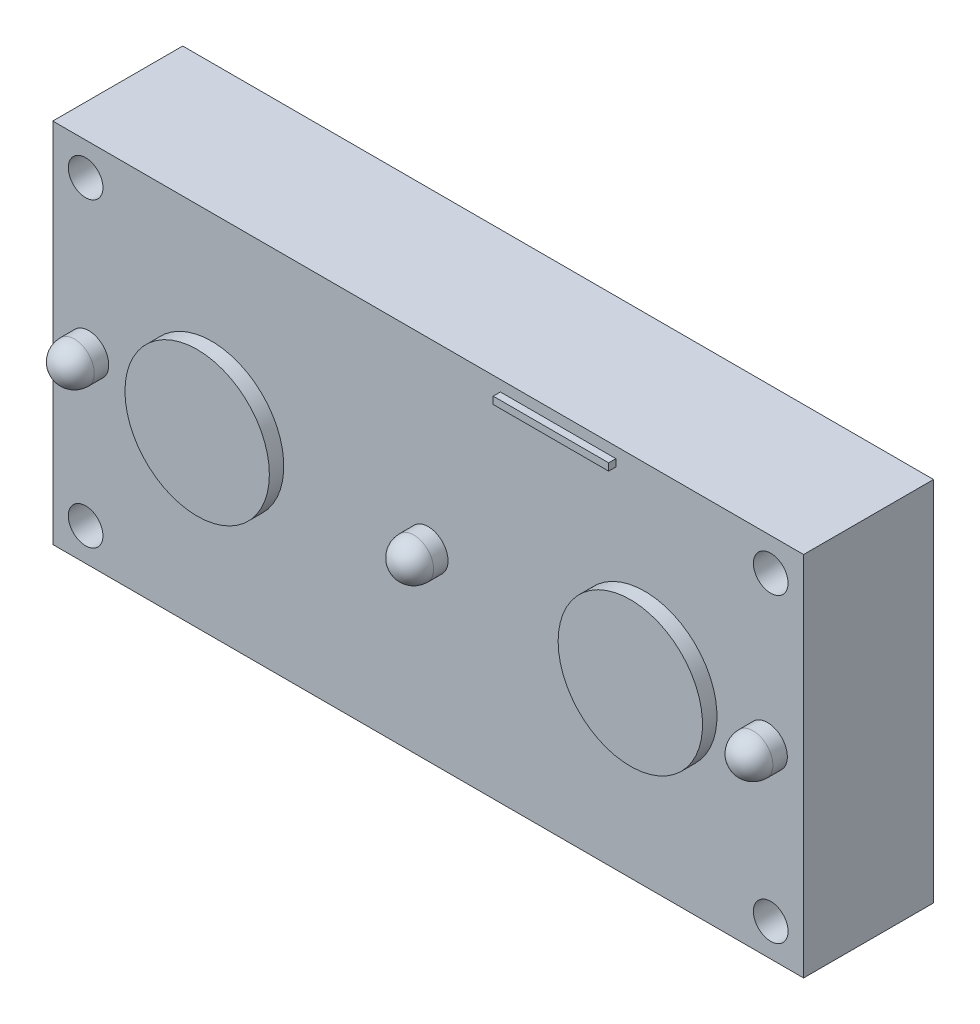
ISO-10303-21;
HEADER;
FILE_DESCRIPTION(('STEP AP214'),'2;1');
FILE_NAME('part.step','',(''),(''),'','','');
FILE_SCHEMA(('AUTOMOTIVE_DESIGN { 1 0 10303 214 1 1 1 1 }'));
ENDSEC;
DATA;
#1=APPLICATION_CONTEXT('core data for automotive mechanical design processes');
#2=APPLICATION_PROTOCOL_DEFINITION('international standard','automotive_design',2000,#1);
#3=PRODUCT_CONTEXT('',#1,'mechanical');
#4=PRODUCT('Part','Part','',(#3));
#5=PRODUCT_RELATED_PRODUCT_CATEGORY('part','',(#4));
#6=PRODUCT_DEFINITION_FORMATION('','',#4);
#7=PRODUCT_DEFINITION_CONTEXT('part definition',#1,'design');
#8=PRODUCT_DEFINITION('design','',#6,#7);
#9=PRODUCT_DEFINITION_SHAPE('','',#8);
#10=(LENGTH_UNIT() NAMED_UNIT(*) SI_UNIT(.MILLI.,.METRE.));
#11=(NAMED_UNIT(*) PLANE_ANGLE_UNIT() SI_UNIT($,.RADIAN.));
#12=(NAMED_UNIT(*) SI_UNIT($,.STERADIAN.) SOLID_ANGLE_UNIT());
#13=UNCERTAINTY_MEASURE_WITH_UNIT(LENGTH_MEASURE(1.E-05),#10,'distance_accuracy_value','');
#14=(GEOMETRIC_REPRESENTATION_CONTEXT(3) GLOBAL_UNCERTAINTY_ASSIGNED_CONTEXT((#13)) GLOBAL_UNIT_ASSIGNED_CONTEXT((#10,
#11,#12)) REPRESENTATION_CONTEXT('',''));
#15=CARTESIAN_POINT('',(0.,0.,0.));
#16=DIRECTION('',(0.,0.,1.));
#17=DIRECTION('',(1.,0.,0.));
#18=AXIS2_PLACEMENT_3D('',#15,#16,#17);
#19=CARTESIAN_POINT('',(0.,0.,9.));
#20=DIRECTION('',(0.,0.,-1.));
#21=DIRECTION('',(-1.,0.,0.));
#22=AXIS2_PLACEMENT_3D('',#19,#20,#21);
#23=PLANE('',#22);
#24=CARTESIAN_POINT('',(23.5,0.,9.));
#25=DIRECTION('',(0.,0.,-1.));
#26=DIRECTION('',(-1.,0.,0.));
#27=AXIS2_PLACEMENT_3D('',#24,#25,#26);
#28=CIRCLE('',#27,1.375);
#29=CARTESIAN_POINT('',(22.125,0.,9.));
#30=VERTEX_POINT('',#29);
#31=EDGE_CURVE('E42',#30,#30,#28,.F.);
#32=ORIENTED_EDGE('',*,*,#31,.F.);
#33=EDGE_LOOP('',(#32));
#34=FACE_BOUND('',#33,.T.);
#35=DIRECTION('',(0.,1.,0.));
#36=VECTOR('',#35,1.);
#37=CARTESIAN_POINT('',(13.,11.95,9.));
#38=LINE('',#37,#36);
#39=CARTESIAN_POINT('',(13.,11.45,9.));
#40=VERTEX_POINT('',#39);
#41=CARTESIAN_POINT('',(13.,11.95,9.));
#42=VERTEX_POINT('',#41);
#43=EDGE_CURVE('E120',#40,#42,#38,.T.);
#44=ORIENTED_EDGE('',*,*,#43,.F.);
#45=DIRECTION('',(1.,0.,0.));
#46=VECTOR('',#45,1.);
#47=CARTESIAN_POINT('',(13.,11.45,9.));
#48=LINE('',#47,#46);
#49=CARTESIAN_POINT('',(5.,11.45,9.));
#50=VERTEX_POINT('',#49);
#51=EDGE_CURVE('E117',#50,#40,#48,.T.);
#52=ORIENTED_EDGE('',*,*,#51,.F.);
#53=DIRECTION('',(0.,-1.,0.));
#54=VECTOR('',#53,1.);
#55=CARTESIAN_POINT('',(5.,11.95,9.));
#56=LINE('',#55,#54);
#57=CARTESIAN_POINT('',(5.,11.95,9.));
#58=VERTEX_POINT('',#57);
#59=EDGE_CURVE('E55',#58,#50,#56,.T.);
#60=ORIENTED_EDGE('',*,*,#59,.F.);
#61=DIRECTION('',(-1.,0.,0.));
#62=VECTOR('',#61,1.);
#63=CARTESIAN_POINT('',(13.,11.95,9.));
#64=LINE('',#63,#62);
#65=EDGE_CURVE('E50',#42,#58,#64,.T.);
#66=ORIENTED_EDGE('',*,*,#65,.F.);
#67=EDGE_LOOP('',(#44,#52,#60,#66));
#68=FACE_BOUND('',#67,.T.);
#69=CARTESIAN_POINT('',(-15.,0.,9.));
#70=DIRECTION('',(0.,0.,-1.));
#71=DIRECTION('',(-1.,0.,0.));
#72=AXIS2_PLACEMENT_3D('',#69,#70,#71);
#73=CIRCLE('',#72,5.);
#74=CARTESIAN_POINT('',(-20.,0.,9.));
#75=VERTEX_POINT('',#74);
#76=EDGE_CURVE('E186',#75,#75,#73,.F.);
#77=ORIENTED_EDGE('',*,*,#76,.F.);
#78=EDGE_LOOP('',(#77));
#79=FACE_BOUND('',#78,.T.);
#80=CARTESIAN_POINT('',(-23.725,10.44,9.));
#81=DIRECTION('',(0.,0.,1.));
#82=DIRECTION('',(1.,0.,0.));
#83=AXIS2_PLACEMENT_3D('',#80,#81,#82);
#84=CIRCLE('',#83,1.2);
#85=CARTESIAN_POINT('',(-22.525,10.44,9.));
#86=VERTEX_POINT('',#85);
#87=EDGE_CURVE('E132',#86,#86,#84,.T.);
#88=ORIENTED_EDGE('',*,*,#87,.F.);
#89=EDGE_LOOP('',(#88));
#90=FACE_BOUND('',#89,.T.);
#91=CARTESIAN_POINT('',(-23.725,-10.44,9.));
#92=DIRECTION('',(0.,0.,1.));
#93=DIRECTION('',(1.,0.,0.));
#94=AXIS2_PLACEMENT_3D('',#91,#92,#93);
#95=CIRCLE('',#94,1.2);
#96=CARTESIAN_POINT('',(-22.525,-10.44,9.));
#97=VERTEX_POINT('',#96);
#98=EDGE_CURVE('E138',#97,#97,#95,.T.);
#99=ORIENTED_EDGE('',*,*,#98,.F.);
#100=EDGE_LOOP('',(#99));
#101=FACE_BOUND('',#100,.T.);
#102=CARTESIAN_POINT('',(23.725,-10.44,9.));
#103=DIRECTION('',(0.,0.,1.));
#104=DIRECTION('',(1.,0.,0.));
#105=AXIS2_PLACEMENT_3D('',#102,#103,#104);
#106=CIRCLE('',#105,1.2);
#107=CARTESIAN_POINT('',(24.925,-10.44,9.));
#108=VERTEX_POINT('',#107);
#109=EDGE_CURVE('E144',#108,#108,#106,.T.);
#110=ORIENTED_EDGE('',*,*,#109,.F.);
#111=EDGE_LOOP('',(#110));
#112=FACE_BOUND('',#111,.T.);
#113=CARTESIAN_POINT('',(23.725,10.44,9.));
#114=DIRECTION('',(0.,0.,1.));
#115=DIRECTION('',(1.,0.,0.));
#116=AXIS2_PLACEMENT_3D('',#113,#114,#115);
#117=CIRCLE('',#116,1.2);
#118=CARTESIAN_POINT('',(24.925,10.44,9.));
#119=VERTEX_POINT('',#118);
#120=EDGE_CURVE('E150',#119,#119,#117,.T.);
#121=ORIENTED_EDGE('',*,*,#120,.F.);
#122=EDGE_LOOP('',(#121));
#123=FACE_BOUND('',#122,.T.);
#124=DIRECTION('',(0.,1.,0.));
#125=VECTOR('',#124,1.);
#126=CARTESIAN_POINT('',(26.,-12.7,9.));
#127=LINE('',#126,#125);
#128=CARTESIAN_POINT('',(26.,-12.7,9.));
#129=VERTEX_POINT('',#128);
#130=CARTESIAN_POINT('',(26.,12.7,9.));
#131=VERTEX_POINT('',#130);
#132=EDGE_CURVE('E157',#129,#131,#127,.T.);
#133=ORIENTED_EDGE('',*,*,#132,.T.);
#134=DIRECTION('',(-1.,0.,0.));
#135=VECTOR('',#134,1.);
#136=CARTESIAN_POINT('',(-26.,12.7,9.));
#137=LINE('',#136,#135);
#138=CARTESIAN_POINT('',(-26.,12.7,9.));
#139=VERTEX_POINT('',#138);
#140=EDGE_CURVE('E160',#131,#139,#137,.T.);
#141=ORIENTED_EDGE('',*,*,#140,.T.);
#142=DIRECTION('',(0.,-1.,0.));
#143=VECTOR('',#142,1.);
#144=CARTESIAN_POINT('',(-26.,-12.7,9.));
#145=LINE('',#144,#143);
#146=CARTESIAN_POINT('',(-26.,-12.7,9.));
#147=VERTEX_POINT('',#146);
#148=EDGE_CURVE('E163',#139,#147,#145,.T.);
#149=ORIENTED_EDGE('',*,*,#148,.T.);
#150=DIRECTION('',(1.,0.,0.));
#151=VECTOR('',#150,1.);
#152=CARTESIAN_POINT('',(-26.,-12.7,9.));
#153=LINE('',#152,#151);
#154=EDGE_CURVE('E165',#147,#129,#153,.T.);
#155=ORIENTED_EDGE('',*,*,#154,.T.);
#156=EDGE_LOOP('',(#133,#141,#149,#155));
#157=FACE_BOUND('',#156,.T.);
#158=CARTESIAN_POINT('',(15.,0.,9.));
#159=DIRECTION('',(0.,0.,-1.));
#160=DIRECTION('',(-1.,0.,0.));
#161=AXIS2_PLACEMENT_3D('',#158,#159,#160);
#162=CIRCLE('',#161,5.);
#163=CARTESIAN_POINT('',(10.,0.,9.));
#164=VERTEX_POINT('',#163);
#165=EDGE_CURVE('E189',#164,#164,#162,.F.);
#166=ORIENTED_EDGE('',*,*,#165,.F.);
#167=EDGE_LOOP('',(#166));
#168=FACE_BOUND('',#167,.T.);
#169=CARTESIAN_POINT('',(-23.5,0.,9.));
#170=DIRECTION('',(0.,0.,-1.));
#171=DIRECTION('',(-1.,0.,0.));
#172=AXIS2_PLACEMENT_3D('',#169,#170,#171);
#173=CIRCLE('',#172,1.375);
#174=CARTESIAN_POINT('',(-24.875,0.,9.));
#175=VERTEX_POINT('',#174);
#176=EDGE_CURVE('E192',#175,#175,#173,.F.);
#177=ORIENTED_EDGE('',*,*,#176,.F.);
#178=EDGE_LOOP('',(#177));
#179=FACE_BOUND('',#178,.T.);
#180=CARTESIAN_POINT('',(0.,0.,9.));
#181=DIRECTION('',(0.,0.,-1.));
#182=DIRECTION('',(-1.,0.,0.));
#183=AXIS2_PLACEMENT_3D('',#180,#181,#182);
#184=CIRCLE('',#183,1.375);
#185=CARTESIAN_POINT('',(-1.37499999999999,0.,9.));
#186=VERTEX_POINT('',#185);
#187=EDGE_CURVE('E11',#186,#186,#184,.F.);
#188=ORIENTED_EDGE('',*,*,#187,.F.);
#189=EDGE_LOOP('',(#188));
#190=FACE_BOUND('',#189,.T.);
#191=ADVANCED_FACE('F33',(#34,#68,#79,#90,#101,#112,#123,#157,#168,#179,#190),#23,.F.);
#192=CARTESIAN_POINT('',(26.,-12.7,9.));
#193=DIRECTION('',(-1.,0.,0.));
#194=DIRECTION('',(0.,0.,1.));
#195=AXIS2_PLACEMENT_3D('',#192,#193,#194);
#196=PLANE('',#195);
#197=DIRECTION('',(0.,1.,0.));
#198=VECTOR('',#197,1.);
#199=CARTESIAN_POINT('',(26.,-12.7,0.));
#200=LINE('',#199,#198);
#201=CARTESIAN_POINT('',(26.,-12.7,0.));
#202=VERTEX_POINT('',#201);
#203=CARTESIAN_POINT('',(26.,12.7,0.));
#204=VERTEX_POINT('',#203);
#205=EDGE_CURVE('E156',#202,#204,#200,.T.);
#206=ORIENTED_EDGE('',*,*,#205,.T.);
#207=DIRECTION('',(0.,0.,-1.));
#208=VECTOR('',#207,1.);
#209=CARTESIAN_POINT('',(26.,12.7,9.));
#210=LINE('',#209,#208);
#211=EDGE_CURVE('E183',#131,#204,#210,.T.);
#212=ORIENTED_EDGE('',*,*,#211,.F.);
#213=ORIENTED_EDGE('',*,*,#132,.F.);
#214=DIRECTION('',(0.,0.,-1.));
#215=VECTOR('',#214,1.);
#216=CARTESIAN_POINT('',(26.,-12.7,9.));
#217=LINE('',#216,#215);
#218=EDGE_CURVE('E167',#129,#202,#217,.T.);
#219=ORIENTED_EDGE('',*,*,#218,.T.);
#220=EDGE_LOOP('',(#206,#212,#213,#219));
#221=FACE_BOUND('',#220,.T.);
#222=ADVANCED_FACE('F215',(#221),#196,.F.);
#223=CARTESIAN_POINT('',(-26.,12.7,9.));
#224=DIRECTION('',(0.,-1.,0.));
#225=DIRECTION('',(0.,0.,-1.));
#226=AXIS2_PLACEMENT_3D('',#223,#224,#225);
#227=PLANE('',#226);
#228=DIRECTION('',(-1.,0.,0.));
#229=VECTOR('',#228,1.);
#230=CARTESIAN_POINT('',(-26.,12.7,0.));
#231=LINE('',#230,#229);
#232=CARTESIAN_POINT('',(-26.,12.7,0.));
#233=VERTEX_POINT('',#232);
#234=EDGE_CURVE('E170',#204,#233,#231,.T.);
#235=ORIENTED_EDGE('',*,*,#234,.T.);
#236=DIRECTION('',(0.,0.,-1.));
#237=VECTOR('',#236,1.);
#238=CARTESIAN_POINT('',(-26.,12.7,9.));
#239=LINE('',#238,#237);
#240=EDGE_CURVE('E180',#139,#233,#239,.T.);
#241=ORIENTED_EDGE('',*,*,#240,.F.);
#242=ORIENTED_EDGE('',*,*,#140,.F.);
#243=ORIENTED_EDGE('',*,*,#211,.T.);
#244=EDGE_LOOP('',(#235,#241,#242,#243));
#245=FACE_BOUND('',#244,.T.);
#246=ADVANCED_FACE('F309',(#245),#227,.F.);
#247=CARTESIAN_POINT('',(-26.,-12.7,9.));
#248=DIRECTION('',(1.,0.,0.));
#249=DIRECTION('',(0.,0.,-1.));
#250=AXIS2_PLACEMENT_3D('',#247,#248,#249);
#251=PLANE('',#250);
#252=DIRECTION('',(0.,-1.,0.));
#253=VECTOR('',#252,1.);
#254=CARTESIAN_POINT('',(-26.,-12.7,0.));
#255=LINE('',#254,#253);
#256=CARTESIAN_POINT('',(-26.,-12.7,0.));
#257=VERTEX_POINT('',#256);
#258=EDGE_CURVE('E172',#233,#257,#255,.T.);
#259=ORIENTED_EDGE('',*,*,#258,.T.);
#260=DIRECTION('',(0.,0.,-1.));
#261=VECTOR('',#260,1.);
#262=CARTESIAN_POINT('',(-26.,-12.7,9.));
#263=LINE('',#262,#261);
#264=EDGE_CURVE('E177',#147,#257,#263,.T.);
#265=ORIENTED_EDGE('',*,*,#264,.F.);
#266=ORIENTED_EDGE('',*,*,#148,.F.);
#267=ORIENTED_EDGE('',*,*,#240,.T.);
#268=EDGE_LOOP('',(#259,#265,#266,#267));
#269=FACE_BOUND('',#268,.T.);
#270=ADVANCED_FACE('F305',(#269),#251,.F.);
#271=CARTESIAN_POINT('',(-26.,-12.7,9.));
#272=DIRECTION('',(0.,1.,0.));
#273=DIRECTION('',(0.,0.,1.));
#274=AXIS2_PLACEMENT_3D('',#271,#272,#273);
#275=PLANE('',#274);
#276=DIRECTION('',(1.,0.,0.));
#277=VECTOR('',#276,1.);
#278=CARTESIAN_POINT('',(-26.,-12.7,0.));
#279=LINE('',#278,#277);
#280=EDGE_CURVE('E161',#257,#202,#279,.T.);
#281=ORIENTED_EDGE('',*,*,#280,.T.);
#282=ORIENTED_EDGE('',*,*,#218,.F.);
#283=ORIENTED_EDGE('',*,*,#154,.F.);
#284=ORIENTED_EDGE('',*,*,#264,.T.);
#285=EDGE_LOOP('',(#281,#282,#283,#284));
#286=FACE_BOUND('',#285,.T.);
#287=ADVANCED_FACE('F301',(#286),#275,.F.);
#288=CARTESIAN_POINT('',(0.,0.,0.));
#289=DIRECTION('',(0.,0.,-1.));
#290=DIRECTION('',(-1.,0.,0.));
#291=AXIS2_PLACEMENT_3D('',#288,#289,#290);
#292=PLANE('',#291);
#293=CARTESIAN_POINT('',(-23.725,10.44,0.));
#294=DIRECTION('',(0.,0.,1.));
#295=DIRECTION('',(1.,0.,0.));
#296=AXIS2_PLACEMENT_3D('',#293,#294,#295);
#297=CIRCLE('',#296,1.2);
#298=CARTESIAN_POINT('',(-22.525,10.44,0.));
#299=VERTEX_POINT('',#298);
#300=EDGE_CURVE('E135',#299,#299,#297,.T.);
#301=ORIENTED_EDGE('',*,*,#300,.T.);
#302=EDGE_LOOP('',(#301));
#303=FACE_BOUND('',#302,.T.);
#304=CARTESIAN_POINT('',(-23.725,-10.44,0.));
#305=DIRECTION('',(0.,0.,1.));
#306=DIRECTION('',(1.,0.,0.));
#307=AXIS2_PLACEMENT_3D('',#304,#305,#306);
#308=CIRCLE('',#307,1.2);
#309=CARTESIAN_POINT('',(-22.525,-10.44,0.));
#310=VERTEX_POINT('',#309);
#311=EDGE_CURVE('E141',#310,#310,#308,.T.);
#312=ORIENTED_EDGE('',*,*,#311,.T.);
#313=EDGE_LOOP('',(#312));
#314=FACE_BOUND('',#313,.T.);
#315=CARTESIAN_POINT('',(23.725,-10.44,0.));
#316=DIRECTION('',(0.,0.,1.));
#317=DIRECTION('',(1.,0.,0.));
#318=AXIS2_PLACEMENT_3D('',#315,#316,#317);
#319=CIRCLE('',#318,1.2);
#320=CARTESIAN_POINT('',(24.925,-10.44,0.));
#321=VERTEX_POINT('',#320);
#322=EDGE_CURVE('E147',#321,#321,#319,.T.);
#323=ORIENTED_EDGE('',*,*,#322,.T.);
#324=EDGE_LOOP('',(#323));
#325=FACE_BOUND('',#324,.T.);
#326=CARTESIAN_POINT('',(23.725,10.44,0.));
#327=DIRECTION('',(0.,0.,1.));
#328=DIRECTION('',(1.,0.,0.));
#329=AXIS2_PLACEMENT_3D('',#326,#327,#328);
#330=CIRCLE('',#329,1.2);
#331=CARTESIAN_POINT('',(24.925,10.44,0.));
#332=VERTEX_POINT('',#331);
#333=EDGE_CURVE('E153',#332,#332,#330,.T.);
#334=ORIENTED_EDGE('',*,*,#333,.T.);
#335=EDGE_LOOP('',(#334));
#336=FACE_BOUND('',#335,.T.);
#337=ORIENTED_EDGE('',*,*,#205,.F.);
#338=ORIENTED_EDGE('',*,*,#280,.F.);
#339=ORIENTED_EDGE('',*,*,#258,.F.);
#340=ORIENTED_EDGE('',*,*,#234,.F.);
#341=EDGE_LOOP('',(#337,#338,#339,#340));
#342=FACE_BOUND('',#341,.T.);
#343=ADVANCED_FACE('F296',(#303,#314,#325,#336,#342),#292,.T.);
#344=CARTESIAN_POINT('',(23.725,10.44,9.));
#345=DIRECTION('',(0.,0.,1.));
#346=DIRECTION('',(1.,0.,0.));
#347=AXIS2_PLACEMENT_3D('',#344,#345,#346);
#348=CYLINDRICAL_SURFACE('',#347,1.2);
#349=ORIENTED_EDGE('',*,*,#333,.F.);
#350=EDGE_LOOP('',(#349));
#351=FACE_BOUND('',#350,.T.);
#352=ORIENTED_EDGE('',*,*,#120,.T.);
#353=EDGE_LOOP('',(#352));
#354=FACE_BOUND('',#353,.T.);
#355=ADVANCED_FACE('F293',(#351,#354),#348,.F.);
#356=CARTESIAN_POINT('',(23.725,-10.44,9.));
#357=DIRECTION('',(0.,0.,1.));
#358=DIRECTION('',(1.,0.,0.));
#359=AXIS2_PLACEMENT_3D('',#356,#357,#358);
#360=CYLINDRICAL_SURFACE('',#359,1.2);
#361=ORIENTED_EDGE('',*,*,#322,.F.);
#362=EDGE_LOOP('',(#361));
#363=FACE_BOUND('',#362,.T.);
#364=ORIENTED_EDGE('',*,*,#109,.T.);
#365=EDGE_LOOP('',(#364));
#366=FACE_BOUND('',#365,.T.);
#367=ADVANCED_FACE('F289',(#363,#366),#360,.F.);
#368=CARTESIAN_POINT('',(-23.725,-10.44,9.));
#369=DIRECTION('',(0.,0.,1.));
#370=DIRECTION('',(1.,0.,0.));
#371=AXIS2_PLACEMENT_3D('',#368,#369,#370);
#372=CYLINDRICAL_SURFACE('',#371,1.2);
#373=ORIENTED_EDGE('',*,*,#311,.F.);
#374=EDGE_LOOP('',(#373));
#375=FACE_BOUND('',#374,.T.);
#376=ORIENTED_EDGE('',*,*,#98,.T.);
#377=EDGE_LOOP('',(#376));
#378=FACE_BOUND('',#377,.T.);
#379=ADVANCED_FACE('F285',(#375,#378),#372,.F.);
#380=CARTESIAN_POINT('',(-23.725,10.44,9.));
#381=DIRECTION('',(0.,0.,1.));
#382=DIRECTION('',(1.,0.,0.));
#383=AXIS2_PLACEMENT_3D('',#380,#381,#382);
#384=CYLINDRICAL_SURFACE('',#383,1.2);
#385=ORIENTED_EDGE('',*,*,#300,.F.);
#386=EDGE_LOOP('',(#385));
#387=FACE_BOUND('',#386,.T.);
#388=ORIENTED_EDGE('',*,*,#87,.T.);
#389=EDGE_LOOP('',(#388));
#390=FACE_BOUND('',#389,.T.);
#391=ADVANCED_FACE('F281',(#387,#390),#384,.F.);
#392=CARTESIAN_POINT('',(-15.,0.,10.));
#393=DIRECTION('',(0.,0.,-1.));
#394=DIRECTION('',(-1.,0.,0.));
#395=AXIS2_PLACEMENT_3D('',#392,#393,#394);
#396=CYLINDRICAL_SURFACE('',#395,5.);
#397=CARTESIAN_POINT('',(-15.,0.,10.));
#398=DIRECTION('',(0.,0.,1.));
#399=DIRECTION('',(1.,0.,0.));
#400=AXIS2_PLACEMENT_3D('',#397,#398,#399);
#401=CIRCLE('',#400,5.);
#402=CARTESIAN_POINT('',(-10.,0.,10.));
#403=VERTEX_POINT('',#402);
#404=EDGE_CURVE('E124',#403,#403,#401,.T.);
#405=ORIENTED_EDGE('',*,*,#404,.F.);
#406=EDGE_LOOP('',(#405));
#407=FACE_BOUND('',#406,.T.);
#408=ORIENTED_EDGE('',*,*,#76,.T.);
#409=EDGE_LOOP('',(#408));
#410=FACE_BOUND('',#409,.T.);
#411=ADVANCED_FACE('F277',(#407,#410),#396,.T.);
#412=CARTESIAN_POINT('',(-15.,0.,10.));
#413=DIRECTION('',(0.,0.,1.));
#414=DIRECTION('',(1.,0.,0.));
#415=AXIS2_PLACEMENT_3D('',#412,#413,#414);
#416=PLANE('',#415);
#417=ORIENTED_EDGE('',*,*,#404,.T.);
#418=EDGE_LOOP('',(#417));
#419=FACE_BOUND('',#418,.T.);
#420=ADVANCED_FACE('F273',(#419),#416,.T.);
#421=CARTESIAN_POINT('',(15.,0.,10.));
#422=DIRECTION('',(0.,0.,-1.));
#423=DIRECTION('',(-1.,0.,0.));
#424=AXIS2_PLACEMENT_3D('',#421,#422,#423);
#425=CYLINDRICAL_SURFACE('',#424,5.);
#426=CARTESIAN_POINT('',(15.,0.,10.));
#427=DIRECTION('',(0.,0.,1.));
#428=DIRECTION('',(-1.,0.,0.));
#429=AXIS2_PLACEMENT_3D('',#426,#427,#428);
#430=CIRCLE('',#429,5.);
#431=CARTESIAN_POINT('',(10.,0.,10.));
#432=VERTEX_POINT('',#431);
#433=EDGE_CURVE('E121',#432,#432,#430,.T.);
#434=ORIENTED_EDGE('',*,*,#433,.F.);
#435=EDGE_LOOP('',(#434));
#436=FACE_BOUND('',#435,.T.);
#437=ORIENTED_EDGE('',*,*,#165,.T.);
#438=EDGE_LOOP('',(#437));
#439=FACE_BOUND('',#438,.T.);
#440=ADVANCED_FACE('F269',(#436,#439),#425,.T.);
#441=CARTESIAN_POINT('',(15.,0.,10.));
#442=DIRECTION('',(0.,0.,-1.));
#443=DIRECTION('',(-1.,0.,0.));
#444=AXIS2_PLACEMENT_3D('',#441,#442,#443);
#445=PLANE('',#444);
#446=ORIENTED_EDGE('',*,*,#433,.T.);
#447=EDGE_LOOP('',(#446));
#448=FACE_BOUND('',#447,.T.);
#449=ADVANCED_FACE('F266',(#448),#445,.F.);
#450=CARTESIAN_POINT('',(13.,11.95,9.5));
#451=DIRECTION('',(-1.,0.,0.));
#452=DIRECTION('',(0.,0.,1.));
#453=AXIS2_PLACEMENT_3D('',#450,#451,#452);
#454=PLANE('',#453);
#455=ORIENTED_EDGE('',*,*,#43,.T.);
#456=DIRECTION('',(0.,0.,-1.));
#457=VECTOR('',#456,1.);
#458=CARTESIAN_POINT('',(13.,11.95,9.5));
#459=LINE('',#458,#457);
#460=CARTESIAN_POINT('',(13.,11.95,9.5));
#461=VERTEX_POINT('',#460);
#462=EDGE_CURVE('E101',#461,#42,#459,.T.);
#463=ORIENTED_EDGE('',*,*,#462,.F.);
#464=DIRECTION('',(0.,1.,0.));
#465=VECTOR('',#464,1.);
#466=CARTESIAN_POINT('',(13.,11.95,9.5));
#467=LINE('',#466,#465);
#468=CARTESIAN_POINT('',(13.,11.45,9.5));
#469=VERTEX_POINT('',#468);
#470=EDGE_CURVE('E108',#469,#461,#467,.T.);
#471=ORIENTED_EDGE('',*,*,#470,.F.);
#472=DIRECTION('',(0.,0.,-1.));
#473=VECTOR('',#472,1.);
#474=CARTESIAN_POINT('',(13.,11.45,9.5));
#475=LINE('',#474,#473);
#476=EDGE_CURVE('E496',#469,#40,#475,.T.);
#477=ORIENTED_EDGE('',*,*,#476,.T.);
#478=EDGE_LOOP('',(#455,#463,#471,#477));
#479=FACE_BOUND('',#478,.T.);
#480=ADVANCED_FACE('F119',(#479),#454,.F.);
#481=CARTESIAN_POINT('',(13.,11.95,9.5));
#482=DIRECTION('',(0.,-1.,0.));
#483=DIRECTION('',(1.,0.,0.));
#484=AXIS2_PLACEMENT_3D('',#481,#482,#483);
#485=PLANE('',#484);
#486=ORIENTED_EDGE('',*,*,#65,.T.);
#487=DIRECTION('',(0.,0.,-1.));
#488=VECTOR('',#487,1.);
#489=CARTESIAN_POINT('',(5.,11.95,9.5));
#490=LINE('',#489,#488);
#491=CARTESIAN_POINT('',(5.,11.95,9.5));
#492=VERTEX_POINT('',#491);
#493=EDGE_CURVE('E104',#492,#58,#490,.T.);
#494=ORIENTED_EDGE('',*,*,#493,.F.);
#495=DIRECTION('',(-1.,0.,0.));
#496=VECTOR('',#495,1.);
#497=CARTESIAN_POINT('',(13.,11.95,9.5));
#498=LINE('',#497,#496);
#499=EDGE_CURVE('E97',#461,#492,#498,.T.);
#500=ORIENTED_EDGE('',*,*,#499,.F.);
#501=ORIENTED_EDGE('',*,*,#462,.T.);
#502=EDGE_LOOP('',(#486,#494,#500,#501));
#503=FACE_BOUND('',#502,.T.);
#504=ADVANCED_FACE('F99',(#503),#485,.F.);
#505=CARTESIAN_POINT('',(5.,11.95,9.5));
#506=DIRECTION('',(1.,0.,0.));
#507=DIRECTION('',(0.,1.,0.));
#508=AXIS2_PLACEMENT_3D('',#505,#506,#507);
#509=PLANE('',#508);
#510=ORIENTED_EDGE('',*,*,#59,.T.);
#511=DIRECTION('',(0.,0.,-1.));
#512=VECTOR('',#511,1.);
#513=CARTESIAN_POINT('',(5.,11.45,9.5));
#514=LINE('',#513,#512);
#515=CARTESIAN_POINT('',(5.,11.45,9.5));
#516=VERTEX_POINT('',#515);
#517=EDGE_CURVE('E126',#516,#50,#514,.T.);
#518=ORIENTED_EDGE('',*,*,#517,.F.);
#519=DIRECTION('',(0.,-1.,0.));
#520=VECTOR('',#519,1.);
#521=CARTESIAN_POINT('',(5.,11.95,9.5));
#522=LINE('',#521,#520);
#523=EDGE_CURVE('E107',#492,#516,#522,.T.);
#524=ORIENTED_EDGE('',*,*,#523,.F.);
#525=ORIENTED_EDGE('',*,*,#493,.T.);
#526=EDGE_LOOP('',(#510,#518,#524,#525));
#527=FACE_BOUND('',#526,.T.);
#528=ADVANCED_FACE('F257',(#527),#509,.F.);
#529=CARTESIAN_POINT('',(13.,11.45,9.5));
#530=DIRECTION('',(0.,1.,0.));
#531=DIRECTION('',(-1.,0.,0.));
#532=AXIS2_PLACEMENT_3D('',#529,#530,#531);
#533=PLANE('',#532);
#534=ORIENTED_EDGE('',*,*,#51,.T.);
#535=ORIENTED_EDGE('',*,*,#476,.F.);
#536=DIRECTION('',(1.,0.,0.));
#537=VECTOR('',#536,1.);
#538=CARTESIAN_POINT('',(13.,11.45,9.5));
#539=LINE('',#538,#537);
#540=EDGE_CURVE('E113',#516,#469,#539,.T.);
#541=ORIENTED_EDGE('',*,*,#540,.F.);
#542=ORIENTED_EDGE('',*,*,#517,.T.);
#543=EDGE_LOOP('',(#534,#535,#541,#542));
#544=FACE_BOUND('',#543,.T.);
#545=ADVANCED_FACE('F254',(#544),#533,.F.);
#546=CARTESIAN_POINT('',(0.,0.,9.5));
#547=DIRECTION('',(0.,0.,-1.));
#548=DIRECTION('',(-1.,0.,0.));
#549=AXIS2_PLACEMENT_3D('',#546,#547,#548);
#550=PLANE('',#549);
#551=ORIENTED_EDGE('',*,*,#470,.T.);
#552=ORIENTED_EDGE('',*,*,#499,.T.);
#553=ORIENTED_EDGE('',*,*,#523,.T.);
#554=ORIENTED_EDGE('',*,*,#540,.T.);
#555=EDGE_LOOP('',(#551,#552,#553,#554));
#556=FACE_BOUND('',#555,.T.);
#557=ADVANCED_FACE('F111',(#556),#550,.F.);
#558=CARTESIAN_POINT('',(-23.5,0.,10.));
#559=DIRECTION('',(0.,0.,-1.));
#560=DIRECTION('',(-1.,0.,0.));
#561=AXIS2_PLACEMENT_3D('',#558,#559,#560);
#562=CYLINDRICAL_SURFACE('',#561,1.375);
#563=CARTESIAN_POINT('',(-23.5,0.,10.));
#564=DIRECTION('',(0.,0.,1.));
#565=DIRECTION('',(1.,0.,0.));
#566=AXIS2_PLACEMENT_3D('',#563,#564,#565);
#567=CIRCLE('',#566,1.375);
#568=CARTESIAN_POINT('',(-22.125,0.,10.));
#569=VERTEX_POINT('',#568);
#570=EDGE_CURVE('E197',#569,#569,#567,.T.);
#571=ORIENTED_EDGE('',*,*,#570,.F.);
#572=EDGE_LOOP('',(#571));
#573=FACE_BOUND('',#572,.T.);
#574=ORIENTED_EDGE('',*,*,#176,.T.);
#575=EDGE_LOOP('',(#574));
#576=FACE_BOUND('',#575,.T.);
#577=ADVANCED_FACE('F248',(#573,#576),#562,.T.);
#578=CARTESIAN_POINT('',(-23.5,0.,10.));
#579=DIRECTION('',(0.,0.,1.));
#580=DIRECTION('',(1.,0.,0.));
#581=AXIS2_PLACEMENT_3D('',#578,#579,#580);
#582=SPHERICAL_SURFACE('',#581,1.375);
#583=ORIENTED_EDGE('',*,*,#570,.T.);
#584=EDGE_LOOP('',(#583));
#585=FACE_BOUND('',#584,.T.);
#586=ADVANCED_FACE('F210',(#585),#582,.T.);
#587=CARTESIAN_POINT('',(23.5,0.,10.));
#588=DIRECTION('',(0.,0.,-1.));
#589=DIRECTION('',(-1.,0.,0.));
#590=AXIS2_PLACEMENT_3D('',#587,#588,#589);
#591=CYLINDRICAL_SURFACE('',#590,1.375);
#592=CARTESIAN_POINT('',(23.5,0.,10.));
#593=DIRECTION('',(0.,0.,1.));
#594=DIRECTION('',(-1.,0.,0.));
#595=AXIS2_PLACEMENT_3D('',#592,#593,#594);
#596=CIRCLE('',#595,1.375);
#597=CARTESIAN_POINT('',(22.125,0.,10.));
#598=VERTEX_POINT('',#597);
#599=EDGE_CURVE('E37',#598,#598,#596,.T.);
#600=ORIENTED_EDGE('',*,*,#599,.F.);
#601=EDGE_LOOP('',(#600));
#602=FACE_BOUND('',#601,.T.);
#603=ORIENTED_EDGE('',*,*,#31,.T.);
#604=EDGE_LOOP('',(#603));
#605=FACE_BOUND('',#604,.T.);
#606=ADVANCED_FACE('F207',(#602,#605),#591,.T.);
#607=CARTESIAN_POINT('',(23.5,0.,10.));
#608=DIRECTION('',(0.,0.,1.));
#609=DIRECTION('',(1.,0.,0.));
#610=AXIS2_PLACEMENT_3D('',#607,#608,#609);
#611=SPHERICAL_SURFACE('',#610,1.375);
#612=ORIENTED_EDGE('',*,*,#599,.T.);
#613=EDGE_LOOP('',(#612));
#614=FACE_BOUND('',#613,.T.);
#615=ADVANCED_FACE('F35',(#614),#611,.T.);
#616=CARTESIAN_POINT('',(0.,0.,10.));
#617=DIRECTION('',(0.,0.,-1.));
#618=DIRECTION('',(-1.,0.,0.));
#619=AXIS2_PLACEMENT_3D('',#616,#617,#618);
#620=CYLINDRICAL_SURFACE('',#619,1.375);
#621=CARTESIAN_POINT('',(0.,0.,10.));
#622=DIRECTION('',(0.,0.,1.));
#623=DIRECTION('',(1.,0.,0.));
#624=AXIS2_PLACEMENT_3D('',#621,#622,#623);
#625=CIRCLE('',#624,1.375);
#626=CARTESIAN_POINT('',(1.37500000000001,0.,10.));
#627=VERTEX_POINT('',#626);
#628=EDGE_CURVE('E199',#627,#627,#625,.T.);
#629=ORIENTED_EDGE('',*,*,#628,.F.);
#630=EDGE_LOOP('',(#629));
#631=FACE_BOUND('',#630,.T.);
#632=ORIENTED_EDGE('',*,*,#187,.T.);
#633=EDGE_LOOP('',(#632));
#634=FACE_BOUND('',#633,.T.);
#635=ADVANCED_FACE('F238',(#631,#634),#620,.T.);
#636=CARTESIAN_POINT('',(0.,0.,10.));
#637=DIRECTION('',(0.,0.,1.));
#638=DIRECTION('',(1.,0.,0.));
#639=AXIS2_PLACEMENT_3D('',#636,#637,#638);
#640=SPHERICAL_SURFACE('',#639,1.375);
#641=ORIENTED_EDGE('',*,*,#628,.T.);
#642=EDGE_LOOP('',(#641));
#643=FACE_BOUND('',#642,.T.);
#644=ADVANCED_FACE('F240',(#643),#640,.T.);
#645=CLOSED_SHELL('',(#191,#222,#246,#270,#287,#343,#355,#367,#379,#391,#411,#420,#440,#449,
#480,#504,#528,#545,#557,#577,#586,#606,#615,#635,#644));
#646=MANIFOLD_SOLID_BREP('B2',#645);
#647=ADVANCED_BREP_SHAPE_REPRESENTATION('',(#18,#646),#14);
#648=SHAPE_DEFINITION_REPRESENTATION(#9,#647);
ENDSEC;
END-ISO-10303-21;
